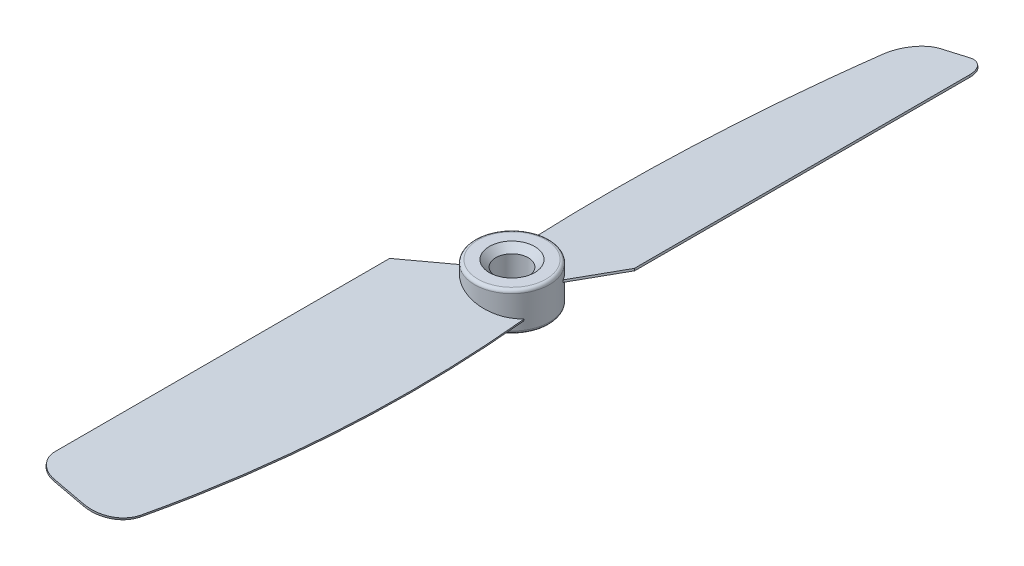
ISO-10303-21;
HEADER;
FILE_DESCRIPTION(('STEP AP214'),'2;1');
FILE_NAME('part.step','',(''),(''),'','','');
FILE_SCHEMA(('AUTOMOTIVE_DESIGN { 1 0 10303 214 1 1 1 1 }'));
ENDSEC;
DATA;
#1=APPLICATION_CONTEXT('core data for automotive mechanical design processes');
#2=APPLICATION_PROTOCOL_DEFINITION('international standard','automotive_design',2000,#1);
#3=PRODUCT_CONTEXT('',#1,'mechanical');
#4=PRODUCT('Part','Part','',(#3));
#5=PRODUCT_RELATED_PRODUCT_CATEGORY('part','',(#4));
#6=PRODUCT_DEFINITION_FORMATION('','',#4);
#7=PRODUCT_DEFINITION_CONTEXT('part definition',#1,'design');
#8=PRODUCT_DEFINITION('design','',#6,#7);
#9=PRODUCT_DEFINITION_SHAPE('','',#8);
#10=(LENGTH_UNIT() NAMED_UNIT(*) SI_UNIT(.MILLI.,.METRE.));
#11=(NAMED_UNIT(*) PLANE_ANGLE_UNIT() SI_UNIT($,.RADIAN.));
#12=(NAMED_UNIT(*) SI_UNIT($,.STERADIAN.) SOLID_ANGLE_UNIT());
#13=UNCERTAINTY_MEASURE_WITH_UNIT(LENGTH_MEASURE(1.E-05),#10,'distance_accuracy_value','');
#14=(GEOMETRIC_REPRESENTATION_CONTEXT(3) GLOBAL_UNCERTAINTY_ASSIGNED_CONTEXT((#13)) GLOBAL_UNIT_ASSIGNED_CONTEXT((#10,
#11,#12)) REPRESENTATION_CONTEXT('',''));
#15=CARTESIAN_POINT('',(0.,0.,0.));
#16=DIRECTION('',(0.,0.,1.));
#17=DIRECTION('',(1.,0.,0.));
#18=AXIS2_PLACEMENT_3D('',#15,#16,#17);
#19=CARTESIAN_POINT('',(0.,3.,0.));
#20=DIRECTION('',(0.,-1.,0.));
#21=DIRECTION('',(0.,0.,-1.));
#22=AXIS2_PLACEMENT_3D('',#19,#20,#21);
#23=CYLINDRICAL_SURFACE('',#22,5.75);
#24=CARTESIAN_POINT('',(0.,2.5,0.));
#25=DIRECTION('',(0.,1.,0.));
#26=DIRECTION('',(0.,0.,1.));
#27=AXIS2_PLACEMENT_3D('',#24,#25,#26);
#28=CIRCLE('',#27,5.75);
#29=CARTESIAN_POINT('',(0.,2.5,5.75));
#30=VERTEX_POINT('',#29);
#31=EDGE_CURVE('E297',#30,#30,#28,.F.);
#32=ORIENTED_EDGE('',*,*,#31,.T.);
#33=EDGE_LOOP('',(#32));
#34=FACE_BOUND('',#33,.T.);
#35=CARTESIAN_POINT('',(0.,-2.5,0.));
#36=DIRECTION('',(0.,1.,0.));
#37=DIRECTION('',(0.,0.,1.));
#38=AXIS2_PLACEMENT_3D('',#35,#36,#37);
#39=CIRCLE('',#38,5.75);
#40=CARTESIAN_POINT('',(0.,-2.5,5.75));
#41=VERTEX_POINT('',#40);
#42=EDGE_CURVE('E293',#41,#41,#39,.T.);
#43=ORIENTED_EDGE('',*,*,#42,.T.);
#44=EDGE_LOOP('',(#43));
#45=FACE_BOUND('',#44,.T.);
#46=CARTESIAN_POINT('',(0.,-0.153945616169008,0.));
#47=DIRECTION('',(0.224951054343865,0.974370064785235,0.));
#48=DIRECTION('',(0.974370064785235,-0.224951054343865,0.));
#49=AXIS2_PLACEMENT_3D('',#46,#47,#48);
#50=ELLIPSE('',#49,5.901248619812,5.75);
#51=CARTESIAN_POINT('',(-4.98144295851569,0.996111108858684,2.87188545228644));
#52=VERTEX_POINT('',#51);
#53=CARTESIAN_POINT('',(4.84788470132692,-1.27316798794965,3.09200807286136));
#54=VERTEX_POINT('',#53);
#55=EDGE_CURVE('E204',#52,#54,#50,.T.);
#56=ORIENTED_EDGE('',*,*,#55,.F.);
#57=CARTESIAN_POINT('',(0.,11.0420826729833,0.));
#58=DIRECTION('',(0.723088117049444,-0.166938045607595,0.670279989191536));
#59=DIRECTION('',(-0.122428914597336,-0.985967387355544,-0.113487761198297));
#60=AXIS2_PLACEMENT_3D('',#57,#58,#59);
#61=ELLIPSE('',#60,34.4439158795231,5.75);
#62=CARTESIAN_POINT('',(-4.95455921342872,1.29779573959779,2.91802039071501));
#63=VERTEX_POINT('',#62);
#64=EDGE_CURVE('E205',#63,#52,#61,.T.);
#65=ORIENTED_EDGE('',*,*,#64,.F.);
#66=CARTESIAN_POINT('',(0.,0.153945616169008,0.));
#67=DIRECTION('',(0.224951054343865,0.974370064785235,0.));
#68=DIRECTION('',(0.974370064785235,-0.224951054343865,0.));
#69=AXIS2_PLACEMENT_3D('',#66,#67,#68);
#70=ELLIPSE('',#69,5.901248619812,5.75);
#71=CARTESIAN_POINT('',(4.90771783657923,-0.979090323316703,2.99613177889791));
#72=VERTEX_POINT('',#71);
#73=EDGE_CURVE('E548',#63,#72,#70,.T.);
#74=ORIENTED_EDGE('',*,*,#73,.T.);
#75=CARTESIAN_POINT('',(4.84788470132694,-1.27316798794965,3.09200807286137));
#76=CARTESIAN_POINT('',(4.85790242620185,-1.22407410971213,3.07630535394187));
#77=CARTESIAN_POINT('',(4.86789738324367,-1.17502069854063,3.06046430331851));
#78=CARTESIAN_POINT('',(4.8878417616611,-1.07699481032964,3.02850553866403));
#79=CARTESIAN_POINT('',(4.89779118303672,-1.02802233329017,3.01238782463291));
#80=CARTESIAN_POINT('',(4.90771783657924,-0.9790903233167,2.99613177889793));
#81=B_SPLINE_CURVE_WITH_KNOTS('',3,(#75,#76,#77,#78,#79,#80),.UNSPECIFIED.,.F.,.F.,(4,2,4),(0.,
0.157523575340724,0.315047150681448),.UNSPECIFIED.);
#82=EDGE_CURVE('E196',#54,#72,#81,.T.);
#83=ORIENTED_EDGE('',*,*,#82,.F.);
#84=EDGE_LOOP('',(#56,#65,#74,#83));
#85=FACE_BOUND('',#84,.T.);
#86=CARTESIAN_POINT('',(0.,-0.153945616169008,0.));
#87=DIRECTION('',(-0.224951054343865,0.974370064785235,0.));
#88=DIRECTION('',(-0.974370064785235,-0.224951054343865,0.));
#89=AXIS2_PLACEMENT_3D('',#86,#87,#88);
#90=ELLIPSE('',#89,5.901248619812,5.75);
#91=CARTESIAN_POINT('',(4.98144295851569,0.996111108858684,-2.87188545228644));
#92=VERTEX_POINT('',#91);
#93=CARTESIAN_POINT('',(-4.84788470132692,-1.27316798794965,-3.09200807286136));
#94=VERTEX_POINT('',#93);
#95=EDGE_CURVE('E149',#92,#94,#90,.T.);
#96=ORIENTED_EDGE('',*,*,#95,.F.);
#97=CARTESIAN_POINT('',(0.,11.0420826729833,0.));
#98=DIRECTION('',(-0.723088117049444,-0.166938045607595,-0.670279989191536));
#99=DIRECTION('',(0.122428914597336,-0.985967387355544,0.113487761198297));
#100=AXIS2_PLACEMENT_3D('',#97,#98,#99);
#101=ELLIPSE('',#100,34.4439158795231,5.75);
#102=CARTESIAN_POINT('',(4.95455921342872,1.29779573959779,-2.91802039071501));
#103=VERTEX_POINT('',#102);
#104=EDGE_CURVE('E224',#103,#92,#101,.T.);
#105=ORIENTED_EDGE('',*,*,#104,.F.);
#106=CARTESIAN_POINT('',(0.,0.153945616169008,0.));
#107=DIRECTION('',(-0.224951054343865,0.974370064785235,0.));
#108=DIRECTION('',(-0.974370064785235,-0.224951054343865,0.));
#109=AXIS2_PLACEMENT_3D('',#106,#107,#108);
#110=ELLIPSE('',#109,5.901248619812,5.75);
#111=CARTESIAN_POINT('',(-4.90771783657923,-0.979090323316703,-2.99613177889791));
#112=VERTEX_POINT('',#111);
#113=EDGE_CURVE('E562',#103,#112,#110,.T.);
#114=ORIENTED_EDGE('',*,*,#113,.T.);
#115=CARTESIAN_POINT('',(-4.84788470132694,-1.27316798794965,-3.09200807286137));
#116=CARTESIAN_POINT('',(-4.85790242620185,-1.22407410971213,-3.07630535394187));
#117=CARTESIAN_POINT('',(-4.86789738324367,-1.17502069854063,-3.06046430331851));
#118=CARTESIAN_POINT('',(-4.8878417616611,-1.07699481032964,-3.02850553866403));
#119=CARTESIAN_POINT('',(-4.89779118303672,-1.02802233329017,-3.01238782463291));
#120=CARTESIAN_POINT('',(-4.90771783657924,-0.9790903233167,-2.99613177889793));
#121=B_SPLINE_CURVE_WITH_KNOTS('',3,(#115,#116,#117,#118,#119,#120),.UNSPECIFIED.,.F.,.F.,(4,2,
4),(0.,0.157523575340724,0.315047150681448),.UNSPECIFIED.);
#122=EDGE_CURVE('E216',#94,#112,#121,.T.);
#123=ORIENTED_EDGE('',*,*,#122,.F.);
#124=EDGE_LOOP('',(#96,#105,#114,#123));
#125=FACE_BOUND('',#124,.T.);
#126=ADVANCED_FACE('F41',(#34,#45,#85,#125),#23,.T.);
#127=CARTESIAN_POINT('',(0.,3.,0.));
#128=DIRECTION('',(0.,1.,0.));
#129=DIRECTION('',(0.,0.,1.));
#130=AXIS2_PLACEMENT_3D('',#127,#128,#129);
#131=PLANE('',#130);
#132=CARTESIAN_POINT('',(0.,3.,0.));
#133=DIRECTION('',(0.,1.,0.));
#134=DIRECTION('',(0.,0.,1.));
#135=AXIS2_PLACEMENT_3D('',#132,#133,#134);
#136=CIRCLE('',#135,3.5);
#137=CARTESIAN_POINT('',(0.,3.,3.5));
#138=VERTEX_POINT('',#137);
#139=EDGE_CURVE('E11',#138,#138,#136,.F.);
#140=ORIENTED_EDGE('',*,*,#139,.T.);
#141=EDGE_LOOP('',(#140));
#142=FACE_BOUND('',#141,.T.);
#143=CARTESIAN_POINT('',(0.,3.,0.));
#144=DIRECTION('',(0.,1.,0.));
#145=DIRECTION('',(0.,0.,1.));
#146=AXIS2_PLACEMENT_3D('',#143,#144,#145);
#147=CIRCLE('',#146,5.25);
#148=CARTESIAN_POINT('',(0.,3.,5.25));
#149=VERTEX_POINT('',#148);
#150=EDGE_CURVE('E291',#149,#149,#147,.T.);
#151=ORIENTED_EDGE('',*,*,#150,.T.);
#152=EDGE_LOOP('',(#151));
#153=FACE_BOUND('',#152,.T.);
#154=ADVANCED_FACE('F193',(#142,#153),#131,.T.);
#155=CARTESIAN_POINT('',(0.,-3.,0.));
#156=DIRECTION('',(0.,1.,0.));
#157=DIRECTION('',(0.,0.,1.));
#158=AXIS2_PLACEMENT_3D('',#155,#156,#157);
#159=PLANE('',#158);
#160=CARTESIAN_POINT('',(0.,-3.,0.));
#161=DIRECTION('',(0.,1.,0.));
#162=DIRECTION('',(0.,0.,1.));
#163=AXIS2_PLACEMENT_3D('',#160,#161,#162);
#164=CIRCLE('',#163,3.50000000000002);
#165=CARTESIAN_POINT('',(0.,-3.,3.50000000000002));
#166=VERTEX_POINT('',#165);
#167=EDGE_CURVE('E50',#166,#166,#164,.T.);
#168=ORIENTED_EDGE('',*,*,#167,.T.);
#169=EDGE_LOOP('',(#168));
#170=FACE_BOUND('',#169,.T.);
#171=CARTESIAN_POINT('',(0.,-3.,0.));
#172=DIRECTION('',(0.,1.,0.));
#173=DIRECTION('',(0.,0.,1.));
#174=AXIS2_PLACEMENT_3D('',#171,#172,#173);
#175=CIRCLE('',#174,5.25);
#176=CARTESIAN_POINT('',(0.,-3.,5.25));
#177=VERTEX_POINT('',#176);
#178=EDGE_CURVE('E302',#177,#177,#175,.F.);
#179=ORIENTED_EDGE('',*,*,#178,.T.);
#180=EDGE_LOOP('',(#179));
#181=FACE_BOUND('',#180,.T.);
#182=ADVANCED_FACE('F190',(#170,#181),#159,.F.);
#183=CARTESIAN_POINT('',(4.82179192227675,-1.2671439952489,2.76715896788951));
#184=CARTESIAN_POINT('',(7.14604673597836,-1.80374049980307,31.4454369331597));
#185=CARTESIAN_POINT('',(2.09857223209446,-0.638439191338993,59.5053593513874));
#186=B_SPLINE_CURVE_WITH_KNOTS('',2,(#183,#184,#185),.UNSPECIFIED.,.F.,.F.,(3,3),(0.,1.),.UNSPECIFIED.);
#187=DIRECTION('',(0.224951054343866,0.974370064785235,0.));
#188=VECTOR('',#187,1.);
#189=SURFACE_OF_LINEAR_EXTRUSION('',#186,#188);
#190=CARTESIAN_POINT('',(2.09857223209446,-0.638439191338993,59.5053593513874));
#191=VERTEX_POINT('',#190);
#192=EDGE_CURVE('E172',#54,#191,#186,.T.);
#193=ORIENTED_EDGE('',*,*,#192,.F.);
#194=ORIENTED_EDGE('',*,*,#82,.T.);
#195=CARTESIAN_POINT('',(4.88927723857991,-0.974832975813326,2.76715896788951));
#196=CARTESIAN_POINT('',(7.21353205228152,-1.5114294803675,31.4454369331597));
#197=CARTESIAN_POINT('',(2.16605754839762,-0.346128171903422,59.5053593513874));
#198=B_SPLINE_CURVE_WITH_KNOTS('',2,(#195,#196,#197),.UNSPECIFIED.,.F.,.F.,(3,3),(0.,1.),.UNSPECIFIED.);
#199=CARTESIAN_POINT('',(2.16605754839762,-0.346128171903422,59.5053593513874));
#200=VERTEX_POINT('',#199);
#201=EDGE_CURVE('E65',#72,#200,#198,.T.);
#202=ORIENTED_EDGE('',*,*,#201,.T.);
#203=DIRECTION('',(0.224951054343866,0.974370064785235,0.));
#204=VECTOR('',#203,1.);
#205=CARTESIAN_POINT('',(2.09857223209446,-0.638439191338993,59.5053593513874));
#206=LINE('',#205,#204);
#207=EDGE_CURVE('E521',#191,#200,#206,.T.);
#208=ORIENTED_EDGE('',*,*,#207,.F.);
#209=EDGE_LOOP('',(#193,#194,#202,#208));
#210=FACE_BOUND('',#209,.T.);
#211=ADVANCED_FACE('F184',(#210),#189,.F.);
#212=CARTESIAN_POINT('',(-2.67377781603569,0.46334463169081,58.5));
#213=DIRECTION('',(0.224951054343866,0.974370064785235,0.));
#214=DIRECTION('',(-0.974370064785235,0.224951054343866,0.));
#215=AXIS2_PLACEMENT_3D('',#212,#213,#214);
#216=CYLINDRICAL_SURFACE('',#215,5.);
#217=CARTESIAN_POINT('',(-2.60629249973253,0.755655651126381,58.5));
#218=DIRECTION('',(-0.224951054343866,-0.974370064785235,0.));
#219=DIRECTION('',(0.974370064785235,-0.224951054343866,0.));
#220=AXIS2_PLACEMENT_3D('',#217,#218,#219);
#221=CIRCLE('',#220,5.);
#222=CARTESIAN_POINT('',(-2.60629249973253,0.755655651126381,63.5));
#223=VERTEX_POINT('',#222);
#224=EDGE_CURVE('E166',#200,#223,#221,.T.);
#225=ORIENTED_EDGE('',*,*,#224,.T.);
#226=DIRECTION('',(0.224951054343866,0.974370064785235,0.));
#227=VECTOR('',#226,1.);
#228=CARTESIAN_POINT('',(-2.67377781603569,0.46334463169081,63.5));
#229=LINE('',#228,#227);
#230=CARTESIAN_POINT('',(-2.67377781603569,0.46334463169081,63.5));
#231=VERTEX_POINT('',#230);
#232=EDGE_CURVE('E518',#231,#223,#229,.T.);
#233=ORIENTED_EDGE('',*,*,#232,.F.);
#234=CARTESIAN_POINT('',(-2.67377781603569,0.46334463169081,58.5));
#235=DIRECTION('',(-0.224951054343866,-0.974370064785235,0.));
#236=DIRECTION('',(0.974370064785235,-0.224951054343866,0.));
#237=AXIS2_PLACEMENT_3D('',#234,#235,#236);
#238=CIRCLE('',#237,5.);
#239=EDGE_CURVE('E177',#191,#231,#238,.T.);
#240=ORIENTED_EDGE('',*,*,#239,.F.);
#241=ORIENTED_EDGE('',*,*,#207,.T.);
#242=EDGE_LOOP('',(#225,#233,#240,#241));
#243=FACE_BOUND('',#242,.T.);
#244=ADVANCED_FACE('F189',(#243),#216,.T.);
#245=CARTESIAN_POINT('',(-7.25346839661101,1.52064951194302,63.5));
#246=DIRECTION('',(0.,0.,-1.));
#247=DIRECTION('',(-1.,0.,0.));
#248=AXIS2_PLACEMENT_3D('',#245,#246,#247);
#249=PLANE('',#248);
#250=DIRECTION('',(-0.974370064785235,0.224951054343866,0.));
#251=VECTOR('',#250,1.);
#252=CARTESIAN_POINT('',(-7.18598308030785,1.81296053137859,63.5));
#253=LINE('',#252,#251);
#254=CARTESIAN_POINT('',(-7.18598308030785,1.81296053137859,63.5));
#255=VERTEX_POINT('',#254);
#256=EDGE_CURVE('E523',#223,#255,#253,.T.);
#257=ORIENTED_EDGE('',*,*,#256,.T.);
#258=DIRECTION('',(0.224951054343866,0.974370064785235,0.));
#259=VECTOR('',#258,1.);
#260=CARTESIAN_POINT('',(-7.25346839661101,1.52064951194302,63.5));
#261=LINE('',#260,#259);
#262=CARTESIAN_POINT('',(-7.25346839661101,1.52064951194302,63.5));
#263=VERTEX_POINT('',#262);
#264=EDGE_CURVE('E528',#263,#255,#261,.T.);
#265=ORIENTED_EDGE('',*,*,#264,.F.);
#266=DIRECTION('',(-0.974370064785235,0.224951054343866,0.));
#267=VECTOR('',#266,1.);
#268=CARTESIAN_POINT('',(-7.25346839661101,1.52064951194302,63.5));
#269=LINE('',#268,#267);
#270=EDGE_CURVE('E527',#231,#263,#269,.T.);
#271=ORIENTED_EDGE('',*,*,#270,.F.);
#272=ORIENTED_EDGE('',*,*,#232,.T.);
#273=EDGE_LOOP('',(#257,#265,#271,#272));
#274=FACE_BOUND('',#273,.T.);
#275=ADVANCED_FACE('F468',(#274),#249,.F.);
#276=CARTESIAN_POINT('',(-7.25346839661103,1.52064951194302,60.5));
#277=DIRECTION('',(0.224951054343866,0.974370064785235,0.));
#278=DIRECTION('',(-0.974370064785235,0.224951054343866,0.));
#279=AXIS2_PLACEMENT_3D('',#276,#277,#278);
#280=CYLINDRICAL_SURFACE('',#279,3.);
#281=CARTESIAN_POINT('',(-7.18598308030787,1.81296053137859,60.5));
#282=DIRECTION('',(-0.224951054343866,-0.974370064785235,0.));
#283=DIRECTION('',(-0.974370064785235,0.224951054343866,0.));
#284=AXIS2_PLACEMENT_3D('',#281,#282,#283);
#285=CIRCLE('',#284,3.);
#286=CARTESIAN_POINT('',(-10.1090932746636,2.48781369441019,60.5));
#287=VERTEX_POINT('',#286);
#288=EDGE_CURVE('E532',#255,#287,#285,.T.);
#289=ORIENTED_EDGE('',*,*,#288,.T.);
#290=DIRECTION('',(0.224951054343866,0.974370064785235,0.));
#291=VECTOR('',#290,1.);
#292=CARTESIAN_POINT('',(-10.1765785909667,2.19550267497462,60.5));
#293=LINE('',#292,#291);
#294=CARTESIAN_POINT('',(-10.1765785909667,2.19550267497462,60.5));
#295=VERTEX_POINT('',#294);
#296=EDGE_CURVE('E543',#295,#287,#293,.T.);
#297=ORIENTED_EDGE('',*,*,#296,.F.);
#298=CARTESIAN_POINT('',(-7.25346839661103,1.52064951194302,60.5));
#299=DIRECTION('',(-0.224951054343866,-0.974370064785235,0.));
#300=DIRECTION('',(-0.974370064785235,0.224951054343866,0.));
#301=AXIS2_PLACEMENT_3D('',#298,#299,#300);
#302=CIRCLE('',#301,3.);
#303=EDGE_CURVE('E563',#263,#295,#302,.T.);
#304=ORIENTED_EDGE('',*,*,#303,.F.);
#305=ORIENTED_EDGE('',*,*,#264,.T.);
#306=EDGE_LOOP('',(#289,#297,#304,#305));
#307=FACE_BOUND('',#306,.T.);
#308=ADVANCED_FACE('F459',(#307),#280,.T.);
#309=CARTESIAN_POINT('',(-10.1765785909667,2.19550267497462,8.77503785136612));
#310=DIRECTION('',(0.974370064785235,-0.224951054343866,0.));
#311=DIRECTION('',(0.224951054343866,0.974370064785235,0.));
#312=AXIS2_PLACEMENT_3D('',#309,#310,#311);
#313=PLANE('',#312);
#314=DIRECTION('',(0.,0.,-1.));
#315=VECTOR('',#314,1.);
#316=CARTESIAN_POINT('',(-10.1090932746636,2.48781369441019,8.77503785136612));
#317=LINE('',#316,#315);
#318=CARTESIAN_POINT('',(-10.1090932746636,2.48781369441019,8.77503785136612));
#319=VERTEX_POINT('',#318);
#320=EDGE_CURVE('E534',#287,#319,#317,.T.);
#321=ORIENTED_EDGE('',*,*,#320,.T.);
#322=DIRECTION('',(0.224951054343866,0.974370064785235,0.));
#323=VECTOR('',#322,1.);
#324=CARTESIAN_POINT('',(-10.1765785909667,2.19550267497462,8.77503785136612));
#325=LINE('',#324,#323);
#326=CARTESIAN_POINT('',(-10.1765785909667,2.19550267497462,8.77503785136612));
#327=VERTEX_POINT('',#326);
#328=EDGE_CURVE('E540',#327,#319,#325,.T.);
#329=ORIENTED_EDGE('',*,*,#328,.F.);
#330=DIRECTION('',(0.,0.,-1.));
#331=VECTOR('',#330,1.);
#332=CARTESIAN_POINT('',(-10.1765785909667,2.19550267497462,8.77503785136612));
#333=LINE('',#332,#331);
#334=EDGE_CURVE('E559',#295,#327,#333,.T.);
#335=ORIENTED_EDGE('',*,*,#334,.F.);
#336=ORIENTED_EDGE('',*,*,#296,.T.);
#337=EDGE_LOOP('',(#321,#329,#335,#336));
#338=FACE_BOUND('',#337,.T.);
#339=ADVANCED_FACE('F450',(#338),#313,.F.);
#340=CARTESIAN_POINT('',(-10.1765785909667,2.19550267497462,8.77503785136612));
#341=DIRECTION('',(0.723088117049444,-0.166938045607595,0.670279989191536));
#342=DIRECTION('',(0.679819634794706,0.,-0.733379345323818));
#343=AXIS2_PLACEMENT_3D('',#340,#341,#342);
#344=PLANE('',#343);
#345=DIRECTION('',(0.653100756492804,-0.150780190274231,-0.742108304824433));
#346=VECTOR('',#345,1.);
#347=CARTESIAN_POINT('',(-10.1090932746636,2.48781369441019,8.77503785136612));
#348=LINE('',#347,#346);
#349=EDGE_CURVE('E178',#319,#63,#348,.T.);
#350=ORIENTED_EDGE('',*,*,#349,.T.);
#351=ORIENTED_EDGE('',*,*,#64,.T.);
#352=DIRECTION('',(0.653100756492804,-0.150780190274231,-0.742108304824433));
#353=VECTOR('',#352,1.);
#354=CARTESIAN_POINT('',(-10.1765785909667,2.19550267497462,8.77503785136612));
#355=LINE('',#354,#353);
#356=EDGE_CURVE('E544',#327,#52,#355,.T.);
#357=ORIENTED_EDGE('',*,*,#356,.F.);
#358=ORIENTED_EDGE('',*,*,#328,.T.);
#359=EDGE_LOOP('',(#350,#351,#357,#358));
#360=FACE_BOUND('',#359,.T.);
#361=ADVANCED_FACE('F442',(#360),#344,.F.);
#362=CARTESIAN_POINT('',(5.30311440658198,-1.37826604654851,31.2908480463991));
#363=DIRECTION('',(0.224951054343865,0.974370064785235,0.));
#364=DIRECTION('',(-0.974370064785235,0.224951054343866,0.));
#365=AXIS2_PLACEMENT_3D('',#362,#363,#364);
#366=PLANE('',#365);
#367=ORIENTED_EDGE('',*,*,#356,.T.);
#368=ORIENTED_EDGE('',*,*,#55,.T.);
#369=ORIENTED_EDGE('',*,*,#192,.T.);
#370=ORIENTED_EDGE('',*,*,#239,.T.);
#371=ORIENTED_EDGE('',*,*,#270,.T.);
#372=ORIENTED_EDGE('',*,*,#303,.T.);
#373=ORIENTED_EDGE('',*,*,#334,.T.);
#374=EDGE_LOOP('',(#367,#368,#369,#370,#371,#372,#373));
#375=FACE_BOUND('',#374,.T.);
#376=ADVANCED_FACE('F232',(#375),#366,.F.);
#377=CARTESIAN_POINT('',(5.37059972288514,-1.08595502711294,31.2908480463991));
#378=DIRECTION('',(0.224951054343865,0.974370064785235,0.));
#379=DIRECTION('',(-0.974370064785235,0.224951054343866,0.));
#380=AXIS2_PLACEMENT_3D('',#377,#378,#379);
#381=PLANE('',#380);
#382=ORIENTED_EDGE('',*,*,#73,.F.);
#383=ORIENTED_EDGE('',*,*,#349,.F.);
#384=ORIENTED_EDGE('',*,*,#320,.F.);
#385=ORIENTED_EDGE('',*,*,#288,.F.);
#386=ORIENTED_EDGE('',*,*,#256,.F.);
#387=ORIENTED_EDGE('',*,*,#224,.F.);
#388=ORIENTED_EDGE('',*,*,#201,.F.);
#389=EDGE_LOOP('',(#382,#383,#384,#385,#386,#387,#388));
#390=FACE_BOUND('',#389,.T.);
#391=ADVANCED_FACE('F230',(#390),#381,.T.);
#392=CARTESIAN_POINT('',(-4.82179192227675,-1.2671439952489,-2.76715896788951));
#393=CARTESIAN_POINT('',(-7.14604673597836,-1.80374049980307,-31.4454369331597));
#394=CARTESIAN_POINT('',(-2.09857223209446,-0.638439191338993,-59.5053593513874));
#395=B_SPLINE_CURVE_WITH_KNOTS('',2,(#392,#393,#394),.UNSPECIFIED.,.F.,.F.,(3,3),(0.,1.),.UNSPECIFIED.);
#396=DIRECTION('',(-0.224951054343866,0.974370064785235,0.));
#397=VECTOR('',#396,1.);
#398=SURFACE_OF_LINEAR_EXTRUSION('',#395,#397);
#399=CARTESIAN_POINT('',(-2.09857223209446,-0.638439191338993,-59.5053593513874));
#400=VERTEX_POINT('',#399);
#401=EDGE_CURVE('E142',#94,#400,#395,.T.);
#402=ORIENTED_EDGE('',*,*,#401,.F.);
#403=ORIENTED_EDGE('',*,*,#122,.T.);
#404=CARTESIAN_POINT('',(-4.88927723857991,-0.974832975813326,-2.76715896788951));
#405=CARTESIAN_POINT('',(-7.21353205228152,-1.5114294803675,-31.4454369331597));
#406=CARTESIAN_POINT('',(-2.16605754839762,-0.346128171903422,-59.5053593513874));
#407=B_SPLINE_CURVE_WITH_KNOTS('',2,(#404,#405,#406),.UNSPECIFIED.,.F.,.F.,(3,3),(0.,1.),.UNSPECIFIED.);
#408=CARTESIAN_POINT('',(-2.16605754839762,-0.346128171903422,-59.5053593513874));
#409=VERTEX_POINT('',#408);
#410=EDGE_CURVE('E57',#112,#409,#407,.T.);
#411=ORIENTED_EDGE('',*,*,#410,.T.);
#412=DIRECTION('',(-0.224951054343866,0.974370064785235,0.));
#413=VECTOR('',#412,1.);
#414=CARTESIAN_POINT('',(-2.09857223209446,-0.638439191338993,-59.5053593513874));
#415=LINE('',#414,#413);
#416=EDGE_CURVE('E158',#400,#409,#415,.T.);
#417=ORIENTED_EDGE('',*,*,#416,.F.);
#418=EDGE_LOOP('',(#402,#403,#411,#417));
#419=FACE_BOUND('',#418,.T.);
#420=ADVANCED_FACE('F164',(#419),#398,.F.);
#421=CARTESIAN_POINT('',(2.67377781603569,0.46334463169081,-58.5));
#422=DIRECTION('',(-0.224951054343866,0.974370064785235,0.));
#423=DIRECTION('',(-0.974370064785235,-0.224951054343866,0.));
#424=AXIS2_PLACEMENT_3D('',#421,#422,#423);
#425=CYLINDRICAL_SURFACE('',#424,5.);
#426=CARTESIAN_POINT('',(2.60629249973253,0.755655651126381,-58.5));
#427=DIRECTION('',(0.224951054343866,-0.974370064785235,0.));
#428=DIRECTION('',(-0.974370064785235,-0.224951054343866,0.));
#429=AXIS2_PLACEMENT_3D('',#426,#427,#428);
#430=CIRCLE('',#429,5.);
#431=CARTESIAN_POINT('',(2.60629249973253,0.755655651126381,-63.5));
#432=VERTEX_POINT('',#431);
#433=EDGE_CURVE('E252',#409,#432,#430,.T.);
#434=ORIENTED_EDGE('',*,*,#433,.T.);
#435=DIRECTION('',(-0.224951054343866,0.974370064785235,0.));
#436=VECTOR('',#435,1.);
#437=CARTESIAN_POINT('',(2.67377781603569,0.46334463169081,-63.5));
#438=LINE('',#437,#436);
#439=CARTESIAN_POINT('',(2.67377781603569,0.46334463169081,-63.5));
#440=VERTEX_POINT('',#439);
#441=EDGE_CURVE('E160',#440,#432,#438,.T.);
#442=ORIENTED_EDGE('',*,*,#441,.F.);
#443=CARTESIAN_POINT('',(2.67377781603569,0.46334463169081,-58.5));
#444=DIRECTION('',(0.224951054343866,-0.974370064785235,0.));
#445=DIRECTION('',(-0.974370064785235,-0.224951054343866,0.));
#446=AXIS2_PLACEMENT_3D('',#443,#444,#445);
#447=CIRCLE('',#446,5.);
#448=EDGE_CURVE('E146',#400,#440,#447,.T.);
#449=ORIENTED_EDGE('',*,*,#448,.F.);
#450=ORIENTED_EDGE('',*,*,#416,.T.);
#451=EDGE_LOOP('',(#434,#442,#449,#450));
#452=FACE_BOUND('',#451,.T.);
#453=ADVANCED_FACE('F157',(#452),#425,.T.);
#454=CARTESIAN_POINT('',(7.25346839661101,1.52064951194302,-63.5));
#455=DIRECTION('',(0.,0.,1.));
#456=DIRECTION('',(1.,0.,0.));
#457=AXIS2_PLACEMENT_3D('',#454,#455,#456);
#458=PLANE('',#457);
#459=DIRECTION('',(0.974370064785235,0.224951054343866,0.));
#460=VECTOR('',#459,1.);
#461=CARTESIAN_POINT('',(7.18598308030785,1.81296053137859,-63.5));
#462=LINE('',#461,#460);
#463=CARTESIAN_POINT('',(7.18598308030785,1.81296053137859,-63.5));
#464=VERTEX_POINT('',#463);
#465=EDGE_CURVE('E257',#432,#464,#462,.T.);
#466=ORIENTED_EDGE('',*,*,#465,.T.);
#467=DIRECTION('',(-0.224951054343866,0.974370064785235,0.));
#468=VECTOR('',#467,1.);
#469=CARTESIAN_POINT('',(7.25346839661101,1.52064951194302,-63.5));
#470=LINE('',#469,#468);
#471=CARTESIAN_POINT('',(7.25346839661101,1.52064951194302,-63.5));
#472=VERTEX_POINT('',#471);
#473=EDGE_CURVE('E168',#472,#464,#470,.T.);
#474=ORIENTED_EDGE('',*,*,#473,.F.);
#475=DIRECTION('',(0.974370064785235,0.224951054343866,0.));
#476=VECTOR('',#475,1.);
#477=CARTESIAN_POINT('',(7.25346839661101,1.52064951194302,-63.5));
#478=LINE('',#477,#476);
#479=EDGE_CURVE('E162',#440,#472,#478,.T.);
#480=ORIENTED_EDGE('',*,*,#479,.F.);
#481=ORIENTED_EDGE('',*,*,#441,.T.);
#482=EDGE_LOOP('',(#466,#474,#480,#481));
#483=FACE_BOUND('',#482,.T.);
#484=ADVANCED_FACE('F406',(#483),#458,.F.);
#485=CARTESIAN_POINT('',(7.25346839661103,1.52064951194302,-60.5));
#486=DIRECTION('',(-0.224951054343866,0.974370064785235,0.));
#487=DIRECTION('',(-0.974370064785235,-0.224951054343866,0.));
#488=AXIS2_PLACEMENT_3D('',#485,#486,#487);
#489=CYLINDRICAL_SURFACE('',#488,3.);
#490=CARTESIAN_POINT('',(7.18598308030787,1.81296053137859,-60.5));
#491=DIRECTION('',(0.224951054343866,-0.974370064785235,0.));
#492=DIRECTION('',(0.974370064785235,0.224951054343866,0.));
#493=AXIS2_PLACEMENT_3D('',#490,#491,#492);
#494=CIRCLE('',#493,3.);
#495=CARTESIAN_POINT('',(10.1090932746636,2.48781369441019,-60.5));
#496=VERTEX_POINT('',#495);
#497=EDGE_CURVE('E259',#464,#496,#494,.T.);
#498=ORIENTED_EDGE('',*,*,#497,.T.);
#499=DIRECTION('',(-0.224951054343866,0.974370064785235,0.));
#500=VECTOR('',#499,1.);
#501=CARTESIAN_POINT('',(10.1765785909667,2.19550267497462,-60.5));
#502=LINE('',#501,#500);
#503=CARTESIAN_POINT('',(10.1765785909667,2.19550267497462,-60.5));
#504=VERTEX_POINT('',#503);
#505=EDGE_CURVE('E267',#504,#496,#502,.T.);
#506=ORIENTED_EDGE('',*,*,#505,.F.);
#507=CARTESIAN_POINT('',(7.25346839661103,1.52064951194302,-60.5));
#508=DIRECTION('',(0.224951054343866,-0.974370064785235,0.));
#509=DIRECTION('',(0.974370064785235,0.224951054343866,0.));
#510=AXIS2_PLACEMENT_3D('',#507,#508,#509);
#511=CIRCLE('',#510,3.);
#512=EDGE_CURVE('E242',#472,#504,#511,.T.);
#513=ORIENTED_EDGE('',*,*,#512,.F.);
#514=ORIENTED_EDGE('',*,*,#473,.T.);
#515=EDGE_LOOP('',(#498,#506,#513,#514));
#516=FACE_BOUND('',#515,.T.);
#517=ADVANCED_FACE('F274',(#516),#489,.T.);
#518=CARTESIAN_POINT('',(10.1765785909667,2.19550267497462,-8.77503785136612));
#519=DIRECTION('',(-0.974370064785235,-0.224951054343866,0.));
#520=DIRECTION('',(0.224951054343866,-0.974370064785235,0.));
#521=AXIS2_PLACEMENT_3D('',#518,#519,#520);
#522=PLANE('',#521);
#523=DIRECTION('',(0.,0.,1.));
#524=VECTOR('',#523,1.);
#525=CARTESIAN_POINT('',(10.1090932746636,2.48781369441019,-8.77503785136612));
#526=LINE('',#525,#524);
#527=CARTESIAN_POINT('',(10.1090932746636,2.48781369441019,-8.77503785136612));
#528=VERTEX_POINT('',#527);
#529=EDGE_CURVE('E261',#496,#528,#526,.T.);
#530=ORIENTED_EDGE('',*,*,#529,.T.);
#531=DIRECTION('',(-0.224951054343866,0.974370064785235,0.));
#532=VECTOR('',#531,1.);
#533=CARTESIAN_POINT('',(10.1765785909667,2.19550267497462,-8.77503785136612));
#534=LINE('',#533,#532);
#535=CARTESIAN_POINT('',(10.1765785909667,2.19550267497462,-8.77503785136612));
#536=VERTEX_POINT('',#535);
#537=EDGE_CURVE('E248',#536,#528,#534,.T.);
#538=ORIENTED_EDGE('',*,*,#537,.F.);
#539=DIRECTION('',(0.,0.,1.));
#540=VECTOR('',#539,1.);
#541=CARTESIAN_POINT('',(10.1765785909667,2.19550267497462,-8.77503785136612));
#542=LINE('',#541,#540);
#543=EDGE_CURVE('E244',#504,#536,#542,.T.);
#544=ORIENTED_EDGE('',*,*,#543,.F.);
#545=ORIENTED_EDGE('',*,*,#505,.T.);
#546=EDGE_LOOP('',(#530,#538,#544,#545));
#547=FACE_BOUND('',#546,.T.);
#548=ADVANCED_FACE('F283',(#547),#522,.F.);
#549=CARTESIAN_POINT('',(10.1765785909667,2.19550267497462,-8.77503785136612));
#550=DIRECTION('',(-0.723088117049444,-0.166938045607595,-0.670279989191536));
#551=DIRECTION('',(-0.679819634794706,0.,0.733379345323818));
#552=AXIS2_PLACEMENT_3D('',#549,#550,#551);
#553=PLANE('',#552);
#554=DIRECTION('',(-0.653100756492804,-0.150780190274231,0.742108304824433));
#555=VECTOR('',#554,1.);
#556=CARTESIAN_POINT('',(10.1090932746636,2.48781369441019,-8.77503785136612));
#557=LINE('',#556,#555);
#558=EDGE_CURVE('E153',#528,#103,#557,.T.);
#559=ORIENTED_EDGE('',*,*,#558,.T.);
#560=ORIENTED_EDGE('',*,*,#104,.T.);
#561=DIRECTION('',(-0.653100756492804,-0.150780190274231,0.742108304824433));
#562=VECTOR('',#561,1.);
#563=CARTESIAN_POINT('',(10.1765785909667,2.19550267497462,-8.77503785136612));
#564=LINE('',#563,#562);
#565=EDGE_CURVE('E246',#536,#92,#564,.T.);
#566=ORIENTED_EDGE('',*,*,#565,.F.);
#567=ORIENTED_EDGE('',*,*,#537,.T.);
#568=EDGE_LOOP('',(#559,#560,#566,#567));
#569=FACE_BOUND('',#568,.T.);
#570=ADVANCED_FACE('F287',(#569),#553,.F.);
#571=CARTESIAN_POINT('',(-5.30311440658198,-1.37826604654851,-31.2908480463991));
#572=DIRECTION('',(-0.224951054343865,0.974370064785235,0.));
#573=DIRECTION('',(0.974370064785235,0.224951054343866,0.));
#574=AXIS2_PLACEMENT_3D('',#571,#572,#573);
#575=PLANE('',#574);
#576=ORIENTED_EDGE('',*,*,#565,.T.);
#577=ORIENTED_EDGE('',*,*,#95,.T.);
#578=ORIENTED_EDGE('',*,*,#401,.T.);
#579=ORIENTED_EDGE('',*,*,#448,.T.);
#580=ORIENTED_EDGE('',*,*,#479,.T.);
#581=ORIENTED_EDGE('',*,*,#512,.T.);
#582=ORIENTED_EDGE('',*,*,#543,.T.);
#583=EDGE_LOOP('',(#576,#577,#578,#579,#580,#581,#582));
#584=FACE_BOUND('',#583,.T.);
#585=ADVANCED_FACE('F145',(#584),#575,.F.);
#586=CARTESIAN_POINT('',(-5.37059972288514,-1.08595502711294,-31.2908480463991));
#587=DIRECTION('',(-0.224951054343865,0.974370064785235,0.));
#588=DIRECTION('',(0.974370064785235,0.224951054343866,0.));
#589=AXIS2_PLACEMENT_3D('',#586,#587,#588);
#590=PLANE('',#589);
#591=ORIENTED_EDGE('',*,*,#113,.F.);
#592=ORIENTED_EDGE('',*,*,#558,.F.);
#593=ORIENTED_EDGE('',*,*,#529,.F.);
#594=ORIENTED_EDGE('',*,*,#497,.F.);
#595=ORIENTED_EDGE('',*,*,#465,.F.);
#596=ORIENTED_EDGE('',*,*,#433,.F.);
#597=ORIENTED_EDGE('',*,*,#410,.F.);
#598=EDGE_LOOP('',(#591,#592,#593,#594,#595,#596,#597));
#599=FACE_BOUND('',#598,.T.);
#600=ADVANCED_FACE('F279',(#599),#590,.T.);
#601=CARTESIAN_POINT('',(0.,3.,0.));
#602=DIRECTION('',(0.,-1.,0.));
#603=DIRECTION('',(0.,0.,-1.));
#604=AXIS2_PLACEMENT_3D('',#601,#602,#603);
#605=CYLINDRICAL_SURFACE('',#604,2.5);
#606=CARTESIAN_POINT('',(0.,-1.99999999999999,0.));
#607=DIRECTION('',(0.,1.,0.));
#608=DIRECTION('',(0.,0.,1.));
#609=AXIS2_PLACEMENT_3D('',#606,#607,#608);
#610=CIRCLE('',#609,2.5);
#611=CARTESIAN_POINT('',(0.,-1.99999999999999,2.5));
#612=VERTEX_POINT('',#611);
#613=EDGE_CURVE('E308',#612,#612,#610,.F.);
#614=ORIENTED_EDGE('',*,*,#613,.T.);
#615=EDGE_LOOP('',(#614));
#616=FACE_BOUND('',#615,.T.);
#617=CARTESIAN_POINT('',(0.,1.99999999999999,0.));
#618=DIRECTION('',(0.,1.,0.));
#619=DIRECTION('',(0.,0.,1.));
#620=AXIS2_PLACEMENT_3D('',#617,#618,#619);
#621=CIRCLE('',#620,2.5);
#622=CARTESIAN_POINT('',(0.,1.99999999999999,2.5));
#623=VERTEX_POINT('',#622);
#624=EDGE_CURVE('E305',#623,#623,#621,.T.);
#625=ORIENTED_EDGE('',*,*,#624,.T.);
#626=EDGE_LOOP('',(#625));
#627=FACE_BOUND('',#626,.T.);
#628=ADVANCED_FACE('F321',(#616,#627),#605,.F.);
#629=CARTESIAN_POINT('',(0.,2.5,0.));
#630=DIRECTION('',(0.,1.,0.));
#631=DIRECTION('',(0.,0.,1.));
#632=AXIS2_PLACEMENT_3D('',#629,#630,#631);
#633=TOROIDAL_SURFACE('',#632,5.25,0.5);
#634=ORIENTED_EDGE('',*,*,#31,.F.);
#635=EDGE_LOOP('',(#634));
#636=FACE_BOUND('',#635,.T.);
#637=ORIENTED_EDGE('',*,*,#150,.F.);
#638=EDGE_LOOP('',(#637));
#639=FACE_BOUND('',#638,.T.);
#640=ADVANCED_FACE('F212',(#636,#639),#633,.T.);
#641=CARTESIAN_POINT('',(0.,-2.5,0.));
#642=DIRECTION('',(0.,1.,0.));
#643=DIRECTION('',(0.,0.,1.));
#644=AXIS2_PLACEMENT_3D('',#641,#642,#643);
#645=TOROIDAL_SURFACE('',#644,5.25,0.5);
#646=ORIENTED_EDGE('',*,*,#178,.F.);
#647=EDGE_LOOP('',(#646));
#648=FACE_BOUND('',#647,.T.);
#649=ORIENTED_EDGE('',*,*,#42,.F.);
#650=EDGE_LOOP('',(#649));
#651=FACE_BOUND('',#650,.T.);
#652=ADVANCED_FACE('F318',(#648,#651),#645,.T.);
#653=CARTESIAN_POINT('',(0.,-1.99999999999999,0.));
#654=DIRECTION('',(0.,-1.,0.));
#655=DIRECTION('',(0.,0.,-1.));
#656=AXIS2_PLACEMENT_3D('',#653,#654,#655);
#657=CONICAL_SURFACE('',#656,2.5,0.785398163397451);
#658=ORIENTED_EDGE('',*,*,#167,.F.);
#659=EDGE_LOOP('',(#658));
#660=FACE_BOUND('',#659,.T.);
#661=ORIENTED_EDGE('',*,*,#613,.F.);
#662=EDGE_LOOP('',(#661));
#663=FACE_BOUND('',#662,.T.);
#664=ADVANCED_FACE('F315',(#660,#663),#657,.F.);
#665=CARTESIAN_POINT('',(0.,3.,0.));
#666=DIRECTION('',(0.,1.,0.));
#667=DIRECTION('',(0.,0.,1.));
#668=AXIS2_PLACEMENT_3D('',#665,#666,#667);
#669=CONICAL_SURFACE('',#668,3.5,0.785398163397446);
#670=ORIENTED_EDGE('',*,*,#624,.F.);
#671=EDGE_LOOP('',(#670));
#672=FACE_BOUND('',#671,.T.);
#673=ORIENTED_EDGE('',*,*,#139,.F.);
#674=EDGE_LOOP('',(#673));
#675=FACE_BOUND('',#674,.T.);
#676=ADVANCED_FACE('F44',(#672,#675),#669,.F.);
#677=CLOSED_SHELL('',(#126,#154,#182,#211,#244,#275,#308,#339,#361,#376,#391,#420,#453,#484,
#517,#548,#570,#585,#600,#628,#640,#652,#664,#676));
#678=MANIFOLD_SOLID_BREP('B2',#677);
#679=ADVANCED_BREP_SHAPE_REPRESENTATION('',(#18,#678),#14);
#680=SHAPE_DEFINITION_REPRESENTATION(#9,#679);
ENDSEC;
END-ISO-10303-21;
